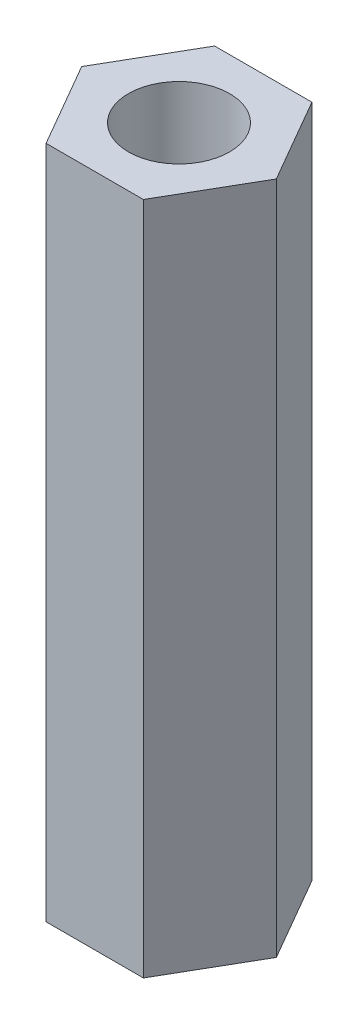
ISO-10303-21;
HEADER;
FILE_DESCRIPTION(('STEP AP214'),'2;1');
FILE_NAME('part.step','',(''),(''),'','','');
FILE_SCHEMA(('AUTOMOTIVE_DESIGN { 1 0 10303 214 1 1 1 1 }'));
ENDSEC;
DATA;
#1=APPLICATION_CONTEXT('core data for automotive mechanical design processes');
#2=APPLICATION_PROTOCOL_DEFINITION('international standard','automotive_design',2000,#1);
#3=PRODUCT_CONTEXT('',#1,'mechanical');
#4=PRODUCT('Part','Part','',(#3));
#5=PRODUCT_RELATED_PRODUCT_CATEGORY('part','',(#4));
#6=PRODUCT_DEFINITION_FORMATION('','',#4);
#7=PRODUCT_DEFINITION_CONTEXT('part definition',#1,'design');
#8=PRODUCT_DEFINITION('design','',#6,#7);
#9=PRODUCT_DEFINITION_SHAPE('','',#8);
#10=(LENGTH_UNIT() NAMED_UNIT(*) SI_UNIT(.MILLI.,.METRE.));
#11=(NAMED_UNIT(*) PLANE_ANGLE_UNIT() SI_UNIT($,.RADIAN.));
#12=(NAMED_UNIT(*) SI_UNIT($,.STERADIAN.) SOLID_ANGLE_UNIT());
#13=UNCERTAINTY_MEASURE_WITH_UNIT(LENGTH_MEASURE(1.E-05),#10,'distance_accuracy_value','');
#14=(GEOMETRIC_REPRESENTATION_CONTEXT(3) GLOBAL_UNCERTAINTY_ASSIGNED_CONTEXT((#13)) GLOBAL_UNIT_ASSIGNED_CONTEXT((#10,
#11,#12)) REPRESENTATION_CONTEXT('',''));
#15=CARTESIAN_POINT('',(0.,0.,0.));
#16=DIRECTION('',(0.,0.,1.));
#17=DIRECTION('',(1.,0.,0.));
#18=AXIS2_PLACEMENT_3D('',#15,#16,#17);
#19=CARTESIAN_POINT('',(0.,10.,0.));
#20=DIRECTION('',(0.,1.,0.));
#21=DIRECTION('',(0.,0.,1.));
#22=AXIS2_PLACEMENT_3D('',#19,#20,#21);
#23=PLANE('',#22);
#24=DIRECTION('',(1.,0.,0.));
#25=VECTOR('',#24,1.);
#26=CARTESIAN_POINT('',(-1.44337567297405,10.,2.5));
#27=LINE('',#26,#25);
#28=CARTESIAN_POINT('',(-1.44337567297405,10.,2.5));
#29=VERTEX_POINT('',#28);
#30=CARTESIAN_POINT('',(1.44337567297408,10.,2.5));
#31=VERTEX_POINT('',#30);
#32=EDGE_CURVE('E133',#29,#31,#27,.T.);
#33=ORIENTED_EDGE('',*,*,#32,.T.);
#34=DIRECTION('',(0.500000000000001,0.,-0.866025403784438));
#35=VECTOR('',#34,1.);
#36=CARTESIAN_POINT('',(1.44337567297408,10.,2.5));
#37=LINE('',#36,#35);
#38=CARTESIAN_POINT('',(2.88675134594815,10.,0.));
#39=VERTEX_POINT('',#38);
#40=EDGE_CURVE('E91',#31,#39,#37,.T.);
#41=ORIENTED_EDGE('',*,*,#40,.T.);
#42=DIRECTION('',(-0.500000000000001,0.,-0.866025403784438));
#43=VECTOR('',#42,1.);
#44=CARTESIAN_POINT('',(2.88675134594815,10.,0.));
#45=LINE('',#44,#43);
#46=CARTESIAN_POINT('',(1.44337567297408,10.,-2.50000000000001));
#47=VERTEX_POINT('',#46);
#48=EDGE_CURVE('E104',#39,#47,#45,.T.);
#49=ORIENTED_EDGE('',*,*,#48,.T.);
#50=DIRECTION('',(-1.,0.,0.));
#51=VECTOR('',#50,1.);
#52=CARTESIAN_POINT('',(1.44337567297408,10.,-2.50000000000001));
#53=LINE('',#52,#51);
#54=CARTESIAN_POINT('',(-1.44337567297405,10.,-2.50000000000001));
#55=VERTEX_POINT('',#54);
#56=EDGE_CURVE('E98',#47,#55,#53,.T.);
#57=ORIENTED_EDGE('',*,*,#56,.T.);
#58=DIRECTION('',(-0.5,0.,0.866025403784438));
#59=VECTOR('',#58,1.);
#60=CARTESIAN_POINT('',(-1.44337567297405,10.,-2.50000000000001));
#61=LINE('',#60,#59);
#62=CARTESIAN_POINT('',(-2.88675134594812,10.,0.));
#63=VERTEX_POINT('',#62);
#64=EDGE_CURVE('E102',#55,#63,#61,.T.);
#65=ORIENTED_EDGE('',*,*,#64,.T.);
#66=DIRECTION('',(0.5,0.,0.866025403784438));
#67=VECTOR('',#66,1.);
#68=CARTESIAN_POINT('',(-2.88675134594812,10.,0.));
#69=LINE('',#68,#67);
#70=EDGE_CURVE('E54',#63,#29,#69,.T.);
#71=ORIENTED_EDGE('',*,*,#70,.T.);
#72=EDGE_LOOP('',(#33,#41,#49,#57,#65,#71));
#73=FACE_BOUND('',#72,.T.);
#74=CARTESIAN_POINT('',(0.,10.,0.));
#75=DIRECTION('',(0.,1.,0.));
#76=DIRECTION('',(0.,0.,1.));
#77=AXIS2_PLACEMENT_3D('',#74,#75,#76);
#78=CIRCLE('',#77,1.5);
#79=CARTESIAN_POINT('',(0.,10.,1.5));
#80=VERTEX_POINT('',#79);
#81=EDGE_CURVE('E126',#80,#80,#78,.T.);
#82=ORIENTED_EDGE('',*,*,#81,.F.);
#83=EDGE_LOOP('',(#82));
#84=FACE_BOUND('',#83,.T.);
#85=ADVANCED_FACE('F37',(#73,#84),#23,.T.);
#86=CARTESIAN_POINT('',(0.,-10.,0.));
#87=DIRECTION('',(0.,1.,0.));
#88=DIRECTION('',(0.,0.,1.));
#89=AXIS2_PLACEMENT_3D('',#86,#87,#88);
#90=PLANE('',#89);
#91=DIRECTION('',(1.,0.,0.));
#92=VECTOR('',#91,1.);
#93=CARTESIAN_POINT('',(-1.44337567297405,-10.,2.5));
#94=LINE('',#93,#92);
#95=CARTESIAN_POINT('',(-1.44337567297405,-10.,2.5));
#96=VERTEX_POINT('',#95);
#97=CARTESIAN_POINT('',(1.44337567297408,-10.,2.5));
#98=VERTEX_POINT('',#97);
#99=EDGE_CURVE('E122',#96,#98,#94,.T.);
#100=ORIENTED_EDGE('',*,*,#99,.F.);
#101=DIRECTION('',(0.5,0.,0.866025403784438));
#102=VECTOR('',#101,1.);
#103=CARTESIAN_POINT('',(-2.88675134594812,-10.,0.));
#104=LINE('',#103,#102);
#105=CARTESIAN_POINT('',(-2.88675134594812,-10.,0.));
#106=VERTEX_POINT('',#105);
#107=EDGE_CURVE('E83',#106,#96,#104,.T.);
#108=ORIENTED_EDGE('',*,*,#107,.F.);
#109=DIRECTION('',(-0.5,0.,0.866025403784438));
#110=VECTOR('',#109,1.);
#111=CARTESIAN_POINT('',(-1.44337567297405,-10.,-2.50000000000001));
#112=LINE('',#111,#110);
#113=CARTESIAN_POINT('',(-1.44337567297405,-10.,-2.50000000000001));
#114=VERTEX_POINT('',#113);
#115=EDGE_CURVE('E77',#114,#106,#112,.T.);
#116=ORIENTED_EDGE('',*,*,#115,.F.);
#117=DIRECTION('',(-1.,0.,0.));
#118=VECTOR('',#117,1.);
#119=CARTESIAN_POINT('',(1.44337567297408,-10.,-2.50000000000001));
#120=LINE('',#119,#118);
#121=CARTESIAN_POINT('',(1.44337567297408,-10.,-2.50000000000001));
#122=VERTEX_POINT('',#121);
#123=EDGE_CURVE('E112',#122,#114,#120,.T.);
#124=ORIENTED_EDGE('',*,*,#123,.F.);
#125=DIRECTION('',(-0.500000000000001,0.,-0.866025403784438));
#126=VECTOR('',#125,1.);
#127=CARTESIAN_POINT('',(2.88675134594815,-10.,0.));
#128=LINE('',#127,#126);
#129=CARTESIAN_POINT('',(2.88675134594815,-10.,0.));
#130=VERTEX_POINT('',#129);
#131=EDGE_CURVE('E128',#130,#122,#128,.T.);
#132=ORIENTED_EDGE('',*,*,#131,.F.);
#133=DIRECTION('',(0.500000000000001,0.,-0.866025403784438));
#134=VECTOR('',#133,1.);
#135=CARTESIAN_POINT('',(1.44337567297408,-10.,2.5));
#136=LINE('',#135,#134);
#137=EDGE_CURVE('E125',#98,#130,#136,.T.);
#138=ORIENTED_EDGE('',*,*,#137,.F.);
#139=EDGE_LOOP('',(#100,#108,#116,#124,#132,#138));
#140=FACE_BOUND('',#139,.T.);
#141=CARTESIAN_POINT('',(0.,-10.,0.));
#142=DIRECTION('',(0.,1.,0.));
#143=DIRECTION('',(0.,0.,1.));
#144=AXIS2_PLACEMENT_3D('',#141,#142,#143);
#145=CIRCLE('',#144,1.5);
#146=CARTESIAN_POINT('',(0.,-10.,1.5));
#147=VERTEX_POINT('',#146);
#148=EDGE_CURVE('E208',#147,#147,#145,.T.);
#149=ORIENTED_EDGE('',*,*,#148,.T.);
#150=EDGE_LOOP('',(#149));
#151=FACE_BOUND('',#150,.T.);
#152=ADVANCED_FACE('F142',(#140,#151),#90,.F.);
#153=CARTESIAN_POINT('',(-1.44337567297405,10.,2.5));
#154=DIRECTION('',(0.,0.,-1.));
#155=DIRECTION('',(-1.,0.,0.));
#156=AXIS2_PLACEMENT_3D('',#153,#154,#155);
#157=PLANE('',#156);
#158=ORIENTED_EDGE('',*,*,#99,.T.);
#159=DIRECTION('',(0.,-1.,0.));
#160=VECTOR('',#159,1.);
#161=CARTESIAN_POINT('',(1.44337567297408,10.,2.5));
#162=LINE('',#161,#160);
#163=EDGE_CURVE('E11',#31,#98,#162,.T.);
#164=ORIENTED_EDGE('',*,*,#163,.F.);
#165=ORIENTED_EDGE('',*,*,#32,.F.);
#166=DIRECTION('',(0.,-1.,0.));
#167=VECTOR('',#166,1.);
#168=CARTESIAN_POINT('',(-1.44337567297405,10.,2.5));
#169=LINE('',#168,#167);
#170=EDGE_CURVE('E118',#29,#96,#169,.T.);
#171=ORIENTED_EDGE('',*,*,#170,.T.);
#172=EDGE_LOOP('',(#158,#164,#165,#171));
#173=FACE_BOUND('',#172,.T.);
#174=ADVANCED_FACE('F39',(#173),#157,.F.);
#175=CARTESIAN_POINT('',(1.44337567297408,10.,2.5));
#176=DIRECTION('',(-0.866025403784438,0.,-0.500000000000001));
#177=DIRECTION('',(-0.500000000000001,0.,0.866025403784438));
#178=AXIS2_PLACEMENT_3D('',#175,#176,#177);
#179=PLANE('',#178);
#180=ORIENTED_EDGE('',*,*,#137,.T.);
#181=DIRECTION('',(0.,-1.,0.));
#182=VECTOR('',#181,1.);
#183=CARTESIAN_POINT('',(2.88675134594815,10.,0.));
#184=LINE('',#183,#182);
#185=EDGE_CURVE('E46',#39,#130,#184,.T.);
#186=ORIENTED_EDGE('',*,*,#185,.F.);
#187=ORIENTED_EDGE('',*,*,#40,.F.);
#188=ORIENTED_EDGE('',*,*,#163,.T.);
#189=EDGE_LOOP('',(#180,#186,#187,#188));
#190=FACE_BOUND('',#189,.T.);
#191=ADVANCED_FACE('F167',(#190),#179,.F.);
#192=CARTESIAN_POINT('',(2.88675134594815,10.,0.));
#193=DIRECTION('',(-0.866025403784438,0.,0.500000000000001));
#194=DIRECTION('',(0.500000000000001,0.,0.866025403784438));
#195=AXIS2_PLACEMENT_3D('',#192,#193,#194);
#196=PLANE('',#195);
#197=ORIENTED_EDGE('',*,*,#131,.T.);
#198=DIRECTION('',(0.,-1.,0.));
#199=VECTOR('',#198,1.);
#200=CARTESIAN_POINT('',(1.44337567297408,10.,-2.50000000000001));
#201=LINE('',#200,#199);
#202=EDGE_CURVE('E113',#47,#122,#201,.T.);
#203=ORIENTED_EDGE('',*,*,#202,.F.);
#204=ORIENTED_EDGE('',*,*,#48,.F.);
#205=ORIENTED_EDGE('',*,*,#185,.T.);
#206=EDGE_LOOP('',(#197,#203,#204,#205));
#207=FACE_BOUND('',#206,.T.);
#208=ADVANCED_FACE('F139',(#207),#196,.F.);
#209=CARTESIAN_POINT('',(1.44337567297408,10.,-2.50000000000001));
#210=DIRECTION('',(0.,0.,1.));
#211=DIRECTION('',(1.,0.,0.));
#212=AXIS2_PLACEMENT_3D('',#209,#210,#211);
#213=PLANE('',#212);
#214=ORIENTED_EDGE('',*,*,#123,.T.);
#215=DIRECTION('',(0.,-1.,0.));
#216=VECTOR('',#215,1.);
#217=CARTESIAN_POINT('',(-1.44337567297405,10.,-2.50000000000001));
#218=LINE('',#217,#216);
#219=EDGE_CURVE('E109',#55,#114,#218,.T.);
#220=ORIENTED_EDGE('',*,*,#219,.F.);
#221=ORIENTED_EDGE('',*,*,#56,.F.);
#222=ORIENTED_EDGE('',*,*,#202,.T.);
#223=EDGE_LOOP('',(#214,#220,#221,#222));
#224=FACE_BOUND('',#223,.T.);
#225=ADVANCED_FACE('F110',(#224),#213,.F.);
#226=CARTESIAN_POINT('',(-1.44337567297405,10.,-2.50000000000001));
#227=DIRECTION('',(0.866025403784439,0.,0.5));
#228=DIRECTION('',(0.5,0.,-0.866025403784439));
#229=AXIS2_PLACEMENT_3D('',#226,#227,#228);
#230=PLANE('',#229);
#231=ORIENTED_EDGE('',*,*,#115,.T.);
#232=DIRECTION('',(0.,-1.,0.));
#233=VECTOR('',#232,1.);
#234=CARTESIAN_POINT('',(-2.88675134594812,10.,0.));
#235=LINE('',#234,#233);
#236=EDGE_CURVE('E114',#63,#106,#235,.T.);
#237=ORIENTED_EDGE('',*,*,#236,.F.);
#238=ORIENTED_EDGE('',*,*,#64,.F.);
#239=ORIENTED_EDGE('',*,*,#219,.T.);
#240=EDGE_LOOP('',(#231,#237,#238,#239));
#241=FACE_BOUND('',#240,.T.);
#242=ADVANCED_FACE('F116',(#241),#230,.F.);
#243=CARTESIAN_POINT('',(-2.88675134594812,10.,0.));
#244=DIRECTION('',(0.866025403784438,0.,-0.5));
#245=DIRECTION('',(-0.5,0.,-0.866025403784438));
#246=AXIS2_PLACEMENT_3D('',#243,#244,#245);
#247=PLANE('',#246);
#248=ORIENTED_EDGE('',*,*,#107,.T.);
#249=ORIENTED_EDGE('',*,*,#170,.F.);
#250=ORIENTED_EDGE('',*,*,#70,.F.);
#251=ORIENTED_EDGE('',*,*,#236,.T.);
#252=EDGE_LOOP('',(#248,#249,#250,#251));
#253=FACE_BOUND('',#252,.T.);
#254=ADVANCED_FACE('F147',(#253),#247,.F.);
#255=CARTESIAN_POINT('',(0.,10.,0.));
#256=DIRECTION('',(0.,-1.,0.));
#257=DIRECTION('',(0.,0.,-1.));
#258=AXIS2_PLACEMENT_3D('',#255,#256,#257);
#259=CYLINDRICAL_SURFACE('',#258,1.5);
#260=ORIENTED_EDGE('',*,*,#81,.T.);
#261=EDGE_LOOP('',(#260));
#262=FACE_BOUND('',#261,.T.);
#263=ORIENTED_EDGE('',*,*,#148,.F.);
#264=EDGE_LOOP('',(#263));
#265=FACE_BOUND('',#264,.T.);
#266=ADVANCED_FACE('F149',(#262,#265),#259,.F.);
#267=CLOSED_SHELL('',(#85,#152,#174,#191,#208,#225,#242,#254,#266));
#268=MANIFOLD_SOLID_BREP('B2',#267);
#269=ADVANCED_BREP_SHAPE_REPRESENTATION('',(#18,#268),#14);
#270=SHAPE_DEFINITION_REPRESENTATION(#9,#269);
ENDSEC;
END-ISO-10303-21;
